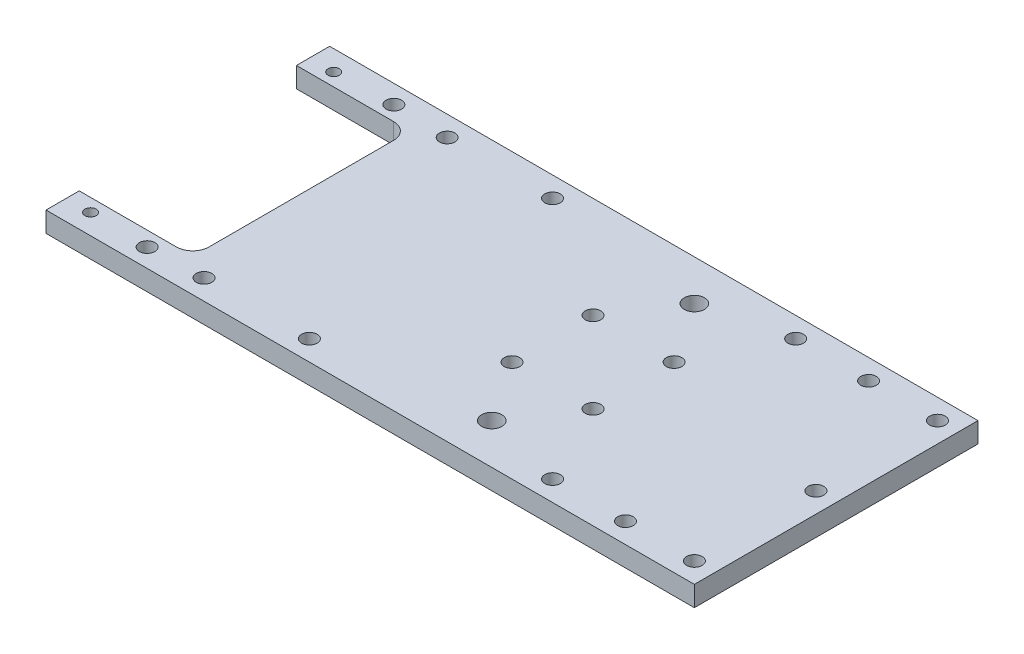
ISO-10303-21;
HEADER;
FILE_DESCRIPTION(('STEP AP214'),'2;1');
FILE_NAME('part.step','',(''),(''),'','','');
FILE_SCHEMA(('AUTOMOTIVE_DESIGN { 1 0 10303 214 1 1 1 1 }'));
ENDSEC;
DATA;
#1=APPLICATION_CONTEXT('core data for automotive mechanical design processes');
#2=APPLICATION_PROTOCOL_DEFINITION('international standard','automotive_design',2000,#1);
#3=PRODUCT_CONTEXT('',#1,'mechanical');
#4=PRODUCT('Part','Part','',(#3));
#5=PRODUCT_RELATED_PRODUCT_CATEGORY('part','',(#4));
#6=PRODUCT_DEFINITION_FORMATION('','',#4);
#7=PRODUCT_DEFINITION_CONTEXT('part definition',#1,'design');
#8=PRODUCT_DEFINITION('design','',#6,#7);
#9=PRODUCT_DEFINITION_SHAPE('','',#8);
#10=(LENGTH_UNIT() NAMED_UNIT(*) SI_UNIT(.MILLI.,.METRE.));
#11=(NAMED_UNIT(*) PLANE_ANGLE_UNIT() SI_UNIT($,.RADIAN.));
#12=(NAMED_UNIT(*) SI_UNIT($,.STERADIAN.) SOLID_ANGLE_UNIT());
#13=UNCERTAINTY_MEASURE_WITH_UNIT(LENGTH_MEASURE(1.E-05),#10,'distance_accuracy_value','');
#14=(GEOMETRIC_REPRESENTATION_CONTEXT(3) GLOBAL_UNCERTAINTY_ASSIGNED_CONTEXT((#13)) GLOBAL_UNIT_ASSIGNED_CONTEXT((#10,
#11,#12)) REPRESENTATION_CONTEXT('',''));
#15=CARTESIAN_POINT('',(0.,0.,0.));
#16=DIRECTION('',(0.,0.,1.));
#17=DIRECTION('',(1.,0.,0.));
#18=AXIS2_PLACEMENT_3D('',#15,#16,#17);
#19=CARTESIAN_POINT('',(-50.8,3.175,22.225));
#20=DIRECTION('',(1.,0.,0.));
#21=DIRECTION('',(0.,0.,-1.));
#22=AXIS2_PLACEMENT_3D('',#19,#20,#21);
#23=PLANE('',#22);
#24=DIRECTION('',(0.,0.,1.));
#25=VECTOR('',#24,1.);
#26=CARTESIAN_POINT('',(-50.8,0.,22.225));
#27=LINE('',#26,#25);
#28=CARTESIAN_POINT('',(-50.8,0.,-22.225));
#29=VERTEX_POINT('',#28);
#30=CARTESIAN_POINT('',(-50.8,0.,-17.018));
#31=VERTEX_POINT('',#30);
#32=EDGE_CURVE('E153',#29,#31,#27,.T.);
#33=ORIENTED_EDGE('',*,*,#32,.T.);
#34=DIRECTION('',(0.,1.,0.));
#35=VECTOR('',#34,1.);
#36=CARTESIAN_POINT('',(-50.8,0.,-17.018));
#37=LINE('',#36,#35);
#38=CARTESIAN_POINT('',(-50.8,3.175,-17.018));
#39=VERTEX_POINT('',#38);
#40=EDGE_CURVE('E144',#31,#39,#37,.T.);
#41=ORIENTED_EDGE('',*,*,#40,.T.);
#42=DIRECTION('',(0.,0.,1.));
#43=VECTOR('',#42,1.);
#44=CARTESIAN_POINT('',(-50.8,3.175,22.225));
#45=LINE('',#44,#43);
#46=CARTESIAN_POINT('',(-50.8,3.175,-22.225));
#47=VERTEX_POINT('',#46);
#48=EDGE_CURVE('E407',#47,#39,#45,.T.);
#49=ORIENTED_EDGE('',*,*,#48,.F.);
#50=DIRECTION('',(0.,-1.,0.));
#51=VECTOR('',#50,1.);
#52=CARTESIAN_POINT('',(-50.8,3.175,-22.225));
#53=LINE('',#52,#51);
#54=EDGE_CURVE('E176',#47,#29,#53,.T.);
#55=ORIENTED_EDGE('',*,*,#54,.T.);
#56=EDGE_LOOP('',(#33,#41,#49,#55));
#57=FACE_BOUND('',#56,.T.);
#58=ADVANCED_FACE('F46',(#57),#23,.F.);
#59=CARTESIAN_POINT('',(50.8,3.175,22.225));
#60=DIRECTION('',(-1.,0.,0.));
#61=DIRECTION('',(0.,0.,1.));
#62=AXIS2_PLACEMENT_3D('',#59,#60,#61);
#63=PLANE('',#62);
#64=DIRECTION('',(0.,0.,-1.));
#65=VECTOR('',#64,1.);
#66=CARTESIAN_POINT('',(50.8,0.,22.225));
#67=LINE('',#66,#65);
#68=CARTESIAN_POINT('',(50.8,0.,22.225));
#69=VERTEX_POINT('',#68);
#70=CARTESIAN_POINT('',(50.8,0.,-22.225));
#71=VERTEX_POINT('',#70);
#72=EDGE_CURVE('E161',#69,#71,#67,.T.);
#73=ORIENTED_EDGE('',*,*,#72,.T.);
#74=DIRECTION('',(0.,-1.,0.));
#75=VECTOR('',#74,1.);
#76=CARTESIAN_POINT('',(50.8,3.175,-22.225));
#77=LINE('',#76,#75);
#78=CARTESIAN_POINT('',(50.8,3.175,-22.225));
#79=VERTEX_POINT('',#78);
#80=EDGE_CURVE('E180',#79,#71,#77,.T.);
#81=ORIENTED_EDGE('',*,*,#80,.F.);
#82=DIRECTION('',(0.,0.,-1.));
#83=VECTOR('',#82,1.);
#84=CARTESIAN_POINT('',(50.8,3.175,22.225));
#85=LINE('',#84,#83);
#86=CARTESIAN_POINT('',(50.8,3.175,22.225));
#87=VERTEX_POINT('',#86);
#88=EDGE_CURVE('E167',#87,#79,#85,.T.);
#89=ORIENTED_EDGE('',*,*,#88,.F.);
#90=DIRECTION('',(0.,-1.,0.));
#91=VECTOR('',#90,1.);
#92=CARTESIAN_POINT('',(50.8,3.175,22.225));
#93=LINE('',#92,#91);
#94=EDGE_CURVE('E168',#87,#69,#93,.T.);
#95=ORIENTED_EDGE('',*,*,#94,.T.);
#96=EDGE_LOOP('',(#73,#81,#89,#95));
#97=FACE_BOUND('',#96,.T.);
#98=ADVANCED_FACE('F416',(#97),#63,.F.);
#99=CARTESIAN_POINT('',(-50.8,3.175,-22.225));
#100=DIRECTION('',(0.,0.,1.));
#101=DIRECTION('',(1.,0.,0.));
#102=AXIS2_PLACEMENT_3D('',#99,#100,#101);
#103=PLANE('',#102);
#104=DIRECTION('',(-1.,0.,0.));
#105=VECTOR('',#104,1.);
#106=CARTESIAN_POINT('',(-50.8,0.,-22.225));
#107=LINE('',#106,#105);
#108=EDGE_CURVE('E154',#71,#29,#107,.T.);
#109=ORIENTED_EDGE('',*,*,#108,.T.);
#110=ORIENTED_EDGE('',*,*,#54,.F.);
#111=DIRECTION('',(-1.,0.,0.));
#112=VECTOR('',#111,1.);
#113=CARTESIAN_POINT('',(-50.8,3.175,-22.225));
#114=LINE('',#113,#112);
#115=EDGE_CURVE('E404',#79,#47,#114,.T.);
#116=ORIENTED_EDGE('',*,*,#115,.F.);
#117=ORIENTED_EDGE('',*,*,#80,.T.);
#118=EDGE_LOOP('',(#109,#110,#116,#117));
#119=FACE_BOUND('',#118,.T.);
#120=ADVANCED_FACE('F421',(#119),#103,.F.);
#121=CARTESIAN_POINT('',(-50.8,3.175,17.018));
#122=VERTEX_POINT('',#121);
#123=CARTESIAN_POINT('',(-50.8,3.175,22.225));
#124=VERTEX_POINT('',#123);
#125=EDGE_CURVE('E142',#122,#124,#45,.T.);
#126=ORIENTED_EDGE('',*,*,#125,.F.);
#127=DIRECTION('',(0.,1.,0.));
#128=VECTOR('',#127,1.);
#129=CARTESIAN_POINT('',(-50.8,0.,17.018));
#130=LINE('',#129,#128);
#131=CARTESIAN_POINT('',(-50.8,0.,17.018));
#132=VERTEX_POINT('',#131);
#133=EDGE_CURVE('E126',#132,#122,#130,.T.);
#134=ORIENTED_EDGE('',*,*,#133,.F.);
#135=CARTESIAN_POINT('',(-50.8,0.,22.225));
#136=VERTEX_POINT('',#135);
#137=EDGE_CURVE('E140',#132,#136,#27,.T.);
#138=ORIENTED_EDGE('',*,*,#137,.T.);
#139=DIRECTION('',(0.,-1.,0.));
#140=VECTOR('',#139,1.);
#141=CARTESIAN_POINT('',(-50.8,3.175,22.225));
#142=LINE('',#141,#140);
#143=EDGE_CURVE('E172',#124,#136,#142,.T.);
#144=ORIENTED_EDGE('',*,*,#143,.F.);
#145=EDGE_LOOP('',(#126,#134,#138,#144));
#146=FACE_BOUND('',#145,.T.);
#147=ADVANCED_FACE('F138',(#146),#23,.F.);
#148=CARTESIAN_POINT('',(-50.8,3.175,22.225));
#149=DIRECTION('',(0.,0.,-1.));
#150=DIRECTION('',(-1.,0.,0.));
#151=AXIS2_PLACEMENT_3D('',#148,#149,#150);
#152=PLANE('',#151);
#153=DIRECTION('',(1.,0.,0.));
#154=VECTOR('',#153,1.);
#155=CARTESIAN_POINT('',(-50.8,0.,22.225));
#156=LINE('',#155,#154);
#157=EDGE_CURVE('E151',#136,#69,#156,.T.);
#158=ORIENTED_EDGE('',*,*,#157,.T.);
#159=ORIENTED_EDGE('',*,*,#94,.F.);
#160=DIRECTION('',(1.,0.,0.));
#161=VECTOR('',#160,1.);
#162=CARTESIAN_POINT('',(-50.8,3.175,22.225));
#163=LINE('',#162,#161);
#164=EDGE_CURVE('E173',#124,#87,#163,.T.);
#165=ORIENTED_EDGE('',*,*,#164,.F.);
#166=ORIENTED_EDGE('',*,*,#143,.T.);
#167=EDGE_LOOP('',(#158,#159,#165,#166));
#168=FACE_BOUND('',#167,.T.);
#169=ADVANCED_FACE('F425',(#168),#152,.F.);
#170=CARTESIAN_POINT('',(0.,3.175,0.));
#171=DIRECTION('',(0.,-1.,0.));
#172=DIRECTION('',(0.,0.,-1.));
#173=AXIS2_PLACEMENT_3D('',#170,#171,#172);
#174=PLANE('',#173);
#175=CARTESIAN_POINT('',(-37.846,3.175,19.3294));
#176=DIRECTION('',(0.,-1.,0.));
#177=DIRECTION('',(0.,0.,-1.));
#178=AXIS2_PLACEMENT_3D('',#175,#176,#177);
#179=CIRCLE('',#178,1.2192);
#180=CARTESIAN_POINT('',(-37.846,3.175,18.1102));
#181=VERTEX_POINT('',#180);
#182=EDGE_CURVE('E244',#181,#181,#179,.T.);
#183=ORIENTED_EDGE('',*,*,#182,.T.);
#184=EDGE_LOOP('',(#183));
#185=FACE_BOUND('',#184,.T.);
#186=CARTESIAN_POINT('',(12.7,3.175,15.875));
#187=DIRECTION('',(0.,-1.,0.));
#188=DIRECTION('',(0.,0.,-1.));
#189=AXIS2_PLACEMENT_3D('',#186,#187,#188);
#190=CIRCLE('',#189,1.5875);
#191=CARTESIAN_POINT('',(12.7,3.175,14.2875));
#192=VERTEX_POINT('',#191);
#193=EDGE_CURVE('E237',#192,#192,#190,.T.);
#194=ORIENTED_EDGE('',*,*,#193,.T.);
#195=EDGE_LOOP('',(#194));
#196=FACE_BOUND('',#195,.T.);
#197=CARTESIAN_POINT('',(-37.846,3.175,-19.3294));
#198=DIRECTION('',(0.,1.,0.));
#199=DIRECTION('',(0.,0.,1.));
#200=AXIS2_PLACEMENT_3D('',#197,#198,#199);
#201=CIRCLE('',#200,1.2192);
#202=CARTESIAN_POINT('',(-37.846,3.175,-18.1102));
#203=VERTEX_POINT('',#202);
#204=EDGE_CURVE('E259',#203,#203,#201,.T.);
#205=ORIENTED_EDGE('',*,*,#204,.F.);
#206=EDGE_LOOP('',(#205));
#207=FACE_BOUND('',#206,.T.);
#208=CARTESIAN_POINT('',(12.7,3.175,-15.875));
#209=DIRECTION('',(0.,1.,0.));
#210=DIRECTION('',(0.,0.,1.));
#211=AXIS2_PLACEMENT_3D('',#208,#209,#210);
#212=CIRCLE('',#211,1.5875);
#213=CARTESIAN_POINT('',(12.7,3.175,-14.2875));
#214=VERTEX_POINT('',#213);
#215=EDGE_CURVE('E263',#214,#214,#212,.T.);
#216=ORIENTED_EDGE('',*,*,#215,.F.);
#217=EDGE_LOOP('',(#216));
#218=FACE_BOUND('',#217,.T.);
#219=CARTESIAN_POINT('',(36.83,3.175,19.05));
#220=DIRECTION('',(0.,1.,0.));
#221=DIRECTION('',(0.,0.,1.));
#222=AXIS2_PLACEMENT_3D('',#219,#220,#221);
#223=CIRCLE('',#222,1.2192);
#224=CARTESIAN_POINT('',(36.83,3.175,20.2692));
#225=VERTEX_POINT('',#224);
#226=EDGE_CURVE('E357',#225,#225,#223,.T.);
#227=ORIENTED_EDGE('',*,*,#226,.F.);
#228=EDGE_LOOP('',(#227));
#229=FACE_BOUND('',#228,.T.);
#230=CARTESIAN_POINT('',(47.625,3.175,19.05));
#231=DIRECTION('',(0.,1.,0.));
#232=DIRECTION('',(0.,0.,1.));
#233=AXIS2_PLACEMENT_3D('',#230,#231,#232);
#234=CIRCLE('',#233,1.2192);
#235=CARTESIAN_POINT('',(47.625,3.175,20.2692));
#236=VERTEX_POINT('',#235);
#237=EDGE_CURVE('E349',#236,#236,#234,.T.);
#238=ORIENTED_EDGE('',*,*,#237,.F.);
#239=EDGE_LOOP('',(#238));
#240=FACE_BOUND('',#239,.T.);
#241=CARTESIAN_POINT('',(47.625,3.175,0.));
#242=DIRECTION('',(0.,1.,0.));
#243=DIRECTION('',(0.,0.,1.));
#244=AXIS2_PLACEMENT_3D('',#241,#242,#243);
#245=CIRCLE('',#244,1.2192);
#246=CARTESIAN_POINT('',(47.625,3.175,1.2192));
#247=VERTEX_POINT('',#246);
#248=EDGE_CURVE('E341',#247,#247,#245,.T.);
#249=ORIENTED_EDGE('',*,*,#248,.F.);
#250=EDGE_LOOP('',(#249));
#251=FACE_BOUND('',#250,.T.);
#252=CARTESIAN_POINT('',(47.625,3.175,-19.05));
#253=DIRECTION('',(0.,1.,0.));
#254=DIRECTION('',(0.,0.,1.));
#255=AXIS2_PLACEMENT_3D('',#252,#253,#254);
#256=CIRCLE('',#255,1.2192);
#257=CARTESIAN_POINT('',(47.625,3.175,-17.8308));
#258=VERTEX_POINT('',#257);
#259=EDGE_CURVE('E332',#258,#258,#256,.T.);
#260=ORIENTED_EDGE('',*,*,#259,.F.);
#261=EDGE_LOOP('',(#260));
#262=FACE_BOUND('',#261,.T.);
#263=CARTESIAN_POINT('',(36.83,3.175,-19.05));
#264=DIRECTION('',(0.,1.,0.));
#265=DIRECTION('',(0.,0.,1.));
#266=AXIS2_PLACEMENT_3D('',#263,#264,#265);
#267=CIRCLE('',#266,1.2192);
#268=CARTESIAN_POINT('',(36.83,3.175,-17.8308));
#269=VERTEX_POINT('',#268);
#270=EDGE_CURVE('E387',#269,#269,#267,.T.);
#271=ORIENTED_EDGE('',*,*,#270,.F.);
#272=EDGE_LOOP('',(#271));
#273=FACE_BOUND('',#272,.T.);
#274=CARTESIAN_POINT('',(25.4,3.175,-19.05));
#275=DIRECTION('',(0.,1.,0.));
#276=DIRECTION('',(0.,0.,1.));
#277=AXIS2_PLACEMENT_3D('',#274,#275,#276);
#278=CIRCLE('',#277,1.2192);
#279=CARTESIAN_POINT('',(25.4,3.175,-17.8308));
#280=VERTEX_POINT('',#279);
#281=EDGE_CURVE('E379',#280,#280,#278,.T.);
#282=ORIENTED_EDGE('',*,*,#281,.F.);
#283=EDGE_LOOP('',(#282));
#284=FACE_BOUND('',#283,.T.);
#285=CARTESIAN_POINT('',(-12.7,3.175,-19.05));
#286=DIRECTION('',(0.,1.,0.));
#287=DIRECTION('',(0.,0.,1.));
#288=AXIS2_PLACEMENT_3D('',#285,#286,#287);
#289=CIRCLE('',#288,1.2192);
#290=CARTESIAN_POINT('',(-12.7,3.175,-17.8308));
#291=VERTEX_POINT('',#290);
#292=EDGE_CURVE('E372',#291,#291,#289,.T.);
#293=ORIENTED_EDGE('',*,*,#292,.F.);
#294=EDGE_LOOP('',(#293));
#295=FACE_BOUND('',#294,.T.);
#296=CARTESIAN_POINT('',(-29.21,3.175,-19.05));
#297=DIRECTION('',(0.,1.,0.));
#298=DIRECTION('',(0.,0.,1.));
#299=AXIS2_PLACEMENT_3D('',#296,#297,#298);
#300=CIRCLE('',#299,1.2192);
#301=CARTESIAN_POINT('',(-29.21,3.175,-17.8308));
#302=VERTEX_POINT('',#301);
#303=EDGE_CURVE('E363',#302,#302,#300,.T.);
#304=ORIENTED_EDGE('',*,*,#303,.F.);
#305=EDGE_LOOP('',(#304));
#306=FACE_BOUND('',#305,.T.);
#307=CARTESIAN_POINT('',(25.4,3.175,19.05));
#308=DIRECTION('',(0.,1.,0.));
#309=DIRECTION('',(0.,0.,1.));
#310=AXIS2_PLACEMENT_3D('',#307,#308,#309);
#311=CIRCLE('',#310,1.2192);
#312=CARTESIAN_POINT('',(25.4,3.175,20.2692));
#313=VERTEX_POINT('',#312);
#314=EDGE_CURVE('E269',#313,#313,#311,.T.);
#315=ORIENTED_EDGE('',*,*,#314,.F.);
#316=EDGE_LOOP('',(#315));
#317=FACE_BOUND('',#316,.T.);
#318=CARTESIAN_POINT('',(-12.7,3.175,19.05));
#319=DIRECTION('',(0.,1.,0.));
#320=DIRECTION('',(0.,0.,1.));
#321=AXIS2_PLACEMENT_3D('',#318,#319,#320);
#322=CIRCLE('',#321,1.2192);
#323=CARTESIAN_POINT('',(-12.7,3.175,20.2692));
#324=VERTEX_POINT('',#323);
#325=EDGE_CURVE('E277',#324,#324,#322,.T.);
#326=ORIENTED_EDGE('',*,*,#325,.F.);
#327=EDGE_LOOP('',(#326));
#328=FACE_BOUND('',#327,.T.);
#329=CARTESIAN_POINT('',(-29.21,3.175,19.05));
#330=DIRECTION('',(0.,1.,0.));
#331=DIRECTION('',(0.,0.,1.));
#332=AXIS2_PLACEMENT_3D('',#329,#330,#331);
#333=CIRCLE('',#332,1.2192);
#334=CARTESIAN_POINT('',(-29.21,3.175,20.2692));
#335=VERTEX_POINT('',#334);
#336=EDGE_CURVE('E285',#335,#335,#333,.T.);
#337=ORIENTED_EDGE('',*,*,#336,.F.);
#338=EDGE_LOOP('',(#337));
#339=FACE_BOUND('',#338,.T.);
#340=CARTESIAN_POINT('',(-46.99,3.175,19.05));
#341=DIRECTION('',(0.,1.,0.));
#342=DIRECTION('',(0.,0.,1.));
#343=AXIS2_PLACEMENT_3D('',#340,#341,#342);
#344=CIRCLE('',#343,0.889000000000003);
#345=CARTESIAN_POINT('',(-46.99,3.175,19.939));
#346=VERTEX_POINT('',#345);
#347=EDGE_CURVE('E293',#346,#346,#344,.T.);
#348=ORIENTED_EDGE('',*,*,#347,.F.);
#349=EDGE_LOOP('',(#348));
#350=FACE_BOUND('',#349,.T.);
#351=CARTESIAN_POINT('',(19.05,3.175,6.35));
#352=DIRECTION('',(0.,1.,0.));
#353=DIRECTION('',(0.,0.,1.));
#354=AXIS2_PLACEMENT_3D('',#351,#352,#353);
#355=CIRCLE('',#354,1.2192);
#356=CARTESIAN_POINT('',(19.05,3.175,7.5692));
#357=VERTEX_POINT('',#356);
#358=EDGE_CURVE('E301',#357,#357,#355,.T.);
#359=ORIENTED_EDGE('',*,*,#358,.F.);
#360=EDGE_LOOP('',(#359));
#361=FACE_BOUND('',#360,.T.);
#362=CARTESIAN_POINT('',(19.05,3.175,-6.35));
#363=DIRECTION('',(0.,1.,0.));
#364=DIRECTION('',(0.,0.,1.));
#365=AXIS2_PLACEMENT_3D('',#362,#363,#364);
#366=CIRCLE('',#365,1.2192);
#367=CARTESIAN_POINT('',(19.05,3.175,-5.1308));
#368=VERTEX_POINT('',#367);
#369=EDGE_CURVE('E309',#368,#368,#366,.T.);
#370=ORIENTED_EDGE('',*,*,#369,.F.);
#371=EDGE_LOOP('',(#370));
#372=FACE_BOUND('',#371,.T.);
#373=CARTESIAN_POINT('',(6.35,3.175,-6.35));
#374=DIRECTION('',(0.,1.,0.));
#375=DIRECTION('',(0.,0.,1.));
#376=AXIS2_PLACEMENT_3D('',#373,#374,#375);
#377=CIRCLE('',#376,1.2192);
#378=CARTESIAN_POINT('',(6.35,3.175,-5.1308));
#379=VERTEX_POINT('',#378);
#380=EDGE_CURVE('E317',#379,#379,#377,.T.);
#381=ORIENTED_EDGE('',*,*,#380,.F.);
#382=EDGE_LOOP('',(#381));
#383=FACE_BOUND('',#382,.T.);
#384=CARTESIAN_POINT('',(6.35,3.175,6.35));
#385=DIRECTION('',(0.,1.,0.));
#386=DIRECTION('',(0.,0.,1.));
#387=AXIS2_PLACEMENT_3D('',#384,#385,#386);
#388=CIRCLE('',#387,1.2192);
#389=CARTESIAN_POINT('',(6.35,3.175,7.5692));
#390=VERTEX_POINT('',#389);
#391=EDGE_CURVE('E325',#390,#390,#388,.T.);
#392=ORIENTED_EDGE('',*,*,#391,.F.);
#393=EDGE_LOOP('',(#392));
#394=FACE_BOUND('',#393,.T.);
#395=CARTESIAN_POINT('',(-46.99,3.175,-19.05));
#396=DIRECTION('',(0.,1.,0.));
#397=DIRECTION('',(0.,0.,1.));
#398=AXIS2_PLACEMENT_3D('',#395,#396,#397);
#399=CIRCLE('',#398,0.889000000000003);
#400=CARTESIAN_POINT('',(-46.99,3.175,-18.161));
#401=VERTEX_POINT('',#400);
#402=EDGE_CURVE('E367',#401,#401,#399,.T.);
#403=ORIENTED_EDGE('',*,*,#402,.F.);
#404=EDGE_LOOP('',(#403));
#405=FACE_BOUND('',#404,.T.);
#406=ORIENTED_EDGE('',*,*,#48,.T.);
#407=DIRECTION('',(-1.,0.,0.));
#408=VECTOR('',#407,1.);
#409=CARTESIAN_POINT('',(-33.02,3.175,-17.018));
#410=LINE('',#409,#408);
#411=CARTESIAN_POINT('',(-35.56,3.175,-17.018));
#412=VERTEX_POINT('',#411);
#413=EDGE_CURVE('E134',#412,#39,#410,.T.);
#414=ORIENTED_EDGE('',*,*,#413,.F.);
#415=CARTESIAN_POINT('',(-35.56,3.175,-14.478));
#416=DIRECTION('',(0.,-1.,0.));
#417=DIRECTION('',(0.,0.,-1.));
#418=AXIS2_PLACEMENT_3D('',#415,#416,#417);
#419=CIRCLE('',#418,2.54);
#420=CARTESIAN_POINT('',(-33.02,3.175,-14.478));
#421=VERTEX_POINT('',#420);
#422=EDGE_CURVE('E55',#412,#421,#419,.T.);
#423=ORIENTED_EDGE('',*,*,#422,.T.);
#424=DIRECTION('',(0.,0.,-1.));
#425=VECTOR('',#424,1.);
#426=CARTESIAN_POINT('',(-33.02,3.175,17.018));
#427=LINE('',#426,#425);
#428=CARTESIAN_POINT('',(-33.02,3.175,14.478));
#429=VERTEX_POINT('',#428);
#430=EDGE_CURVE('E211',#429,#421,#427,.T.);
#431=ORIENTED_EDGE('',*,*,#430,.F.);
#432=CARTESIAN_POINT('',(-35.56,3.175,14.478));
#433=DIRECTION('',(0.,-1.,0.));
#434=DIRECTION('',(0.,0.,-1.));
#435=AXIS2_PLACEMENT_3D('',#432,#433,#434);
#436=CIRCLE('',#435,2.54);
#437=CARTESIAN_POINT('',(-35.56,3.175,17.018));
#438=VERTEX_POINT('',#437);
#439=EDGE_CURVE('E196',#429,#438,#436,.T.);
#440=ORIENTED_EDGE('',*,*,#439,.T.);
#441=DIRECTION('',(1.,0.,0.));
#442=VECTOR('',#441,1.);
#443=CARTESIAN_POINT('',(-33.02,3.175,17.018));
#444=LINE('',#443,#442);
#445=EDGE_CURVE('E217',#122,#438,#444,.T.);
#446=ORIENTED_EDGE('',*,*,#445,.F.);
#447=ORIENTED_EDGE('',*,*,#125,.T.);
#448=ORIENTED_EDGE('',*,*,#164,.T.);
#449=ORIENTED_EDGE('',*,*,#88,.T.);
#450=ORIENTED_EDGE('',*,*,#115,.T.);
#451=EDGE_LOOP('',(#406,#414,#423,#431,#440,#446,#447,#448,#449,#450));
#452=FACE_BOUND('',#451,.T.);
#453=ADVANCED_FACE('F210',(#185,#196,#207,#218,#229,#240,#251,#262,#273,#284,#295,#306,#317,
#328,#339,#350,#361,#372,#383,#394,#405,#452),#174,.F.);
#454=CARTESIAN_POINT('',(0.,0.,0.));
#455=DIRECTION('',(0.,-1.,0.));
#456=DIRECTION('',(0.,0.,-1.));
#457=AXIS2_PLACEMENT_3D('',#454,#455,#456);
#458=PLANE('',#457);
#459=DIRECTION('',(0.,0.,-1.));
#460=VECTOR('',#459,1.);
#461=CARTESIAN_POINT('',(-33.02,0.,17.018));
#462=LINE('',#461,#460);
#463=CARTESIAN_POINT('',(-33.02,0.,14.478));
#464=VERTEX_POINT('',#463);
#465=CARTESIAN_POINT('',(-33.02,0.,-14.478));
#466=VERTEX_POINT('',#465);
#467=EDGE_CURVE('E133',#464,#466,#462,.T.);
#468=ORIENTED_EDGE('',*,*,#467,.T.);
#469=CARTESIAN_POINT('',(-35.56,0.,-14.478));
#470=DIRECTION('',(0.,-1.,0.));
#471=DIRECTION('',(0.,0.,-1.));
#472=AXIS2_PLACEMENT_3D('',#469,#470,#471);
#473=CIRCLE('',#472,2.54);
#474=CARTESIAN_POINT('',(-35.56,0.,-17.018));
#475=VERTEX_POINT('',#474);
#476=EDGE_CURVE('E11',#466,#475,#473,.F.);
#477=ORIENTED_EDGE('',*,*,#476,.T.);
#478=DIRECTION('',(-1.,0.,0.));
#479=VECTOR('',#478,1.);
#480=CARTESIAN_POINT('',(-33.02,0.,-17.018));
#481=LINE('',#480,#479);
#482=EDGE_CURVE('E145',#475,#31,#481,.T.);
#483=ORIENTED_EDGE('',*,*,#482,.T.);
#484=ORIENTED_EDGE('',*,*,#32,.F.);
#485=ORIENTED_EDGE('',*,*,#108,.F.);
#486=ORIENTED_EDGE('',*,*,#72,.F.);
#487=ORIENTED_EDGE('',*,*,#157,.F.);
#488=ORIENTED_EDGE('',*,*,#137,.F.);
#489=DIRECTION('',(1.,0.,0.));
#490=VECTOR('',#489,1.);
#491=CARTESIAN_POINT('',(-33.02,0.,17.018));
#492=LINE('',#491,#490);
#493=CARTESIAN_POINT('',(-35.56,0.,17.018));
#494=VERTEX_POINT('',#493);
#495=EDGE_CURVE('E122',#132,#494,#492,.T.);
#496=ORIENTED_EDGE('',*,*,#495,.T.);
#497=CARTESIAN_POINT('',(-35.56,0.,14.478));
#498=DIRECTION('',(0.,-1.,0.));
#499=DIRECTION('',(0.,0.,-1.));
#500=AXIS2_PLACEMENT_3D('',#497,#498,#499);
#501=CIRCLE('',#500,2.54);
#502=EDGE_CURVE('E199',#494,#464,#501,.F.);
#503=ORIENTED_EDGE('',*,*,#502,.T.);
#504=EDGE_LOOP('',(#468,#477,#483,#484,#485,#486,#487,#488,#496,#503));
#505=FACE_BOUND('',#504,.T.);
#506=CARTESIAN_POINT('',(-37.846,0.,19.3294));
#507=DIRECTION('',(0.,-1.,0.));
#508=DIRECTION('',(0.,0.,-1.));
#509=AXIS2_PLACEMENT_3D('',#506,#507,#508);
#510=CIRCLE('',#509,1.2192);
#511=CARTESIAN_POINT('',(-37.846,0.,18.1102));
#512=VERTEX_POINT('',#511);
#513=EDGE_CURVE('E239',#512,#512,#510,.T.);
#514=ORIENTED_EDGE('',*,*,#513,.F.);
#515=EDGE_LOOP('',(#514));
#516=FACE_BOUND('',#515,.T.);
#517=CARTESIAN_POINT('',(12.7,0.,15.875));
#518=DIRECTION('',(0.,-1.,0.));
#519=DIRECTION('',(0.,0.,-1.));
#520=AXIS2_PLACEMENT_3D('',#517,#518,#519);
#521=CIRCLE('',#520,1.5875);
#522=CARTESIAN_POINT('',(12.7,0.,14.2875));
#523=VERTEX_POINT('',#522);
#524=EDGE_CURVE('E248',#523,#523,#521,.T.);
#525=ORIENTED_EDGE('',*,*,#524,.F.);
#526=EDGE_LOOP('',(#525));
#527=FACE_BOUND('',#526,.T.);
#528=CARTESIAN_POINT('',(-37.846,0.,-19.3294));
#529=DIRECTION('',(0.,1.,0.));
#530=DIRECTION('',(0.,0.,1.));
#531=AXIS2_PLACEMENT_3D('',#528,#529,#530);
#532=CIRCLE('',#531,1.2192);
#533=CARTESIAN_POINT('',(-37.846,0.,-18.1102));
#534=VERTEX_POINT('',#533);
#535=EDGE_CURVE('E254',#534,#534,#532,.T.);
#536=ORIENTED_EDGE('',*,*,#535,.T.);
#537=EDGE_LOOP('',(#536));
#538=FACE_BOUND('',#537,.T.);
#539=CARTESIAN_POINT('',(12.7,0.,-15.875));
#540=DIRECTION('',(0.,1.,0.));
#541=DIRECTION('',(0.,0.,1.));
#542=AXIS2_PLACEMENT_3D('',#539,#540,#541);
#543=CIRCLE('',#542,1.5875);
#544=CARTESIAN_POINT('',(12.7,0.,-14.2875));
#545=VERTEX_POINT('',#544);
#546=EDGE_CURVE('E243',#545,#545,#543,.T.);
#547=ORIENTED_EDGE('',*,*,#546,.T.);
#548=EDGE_LOOP('',(#547));
#549=FACE_BOUND('',#548,.T.);
#550=CARTESIAN_POINT('',(36.83,0.,19.05));
#551=DIRECTION('',(0.,1.,0.));
#552=DIRECTION('',(0.,0.,1.));
#553=AXIS2_PLACEMENT_3D('',#550,#551,#552);
#554=CIRCLE('',#553,1.2192);
#555=CARTESIAN_POINT('',(36.83,0.,20.2692));
#556=VERTEX_POINT('',#555);
#557=EDGE_CURVE('E272',#556,#556,#554,.T.);
#558=ORIENTED_EDGE('',*,*,#557,.T.);
#559=EDGE_LOOP('',(#558));
#560=FACE_BOUND('',#559,.T.);
#561=CARTESIAN_POINT('',(47.625,0.,19.05));
#562=DIRECTION('',(0.,1.,0.));
#563=DIRECTION('',(0.,0.,1.));
#564=AXIS2_PLACEMENT_3D('',#561,#562,#563);
#565=CIRCLE('',#564,1.2192);
#566=CARTESIAN_POINT('',(47.625,0.,20.2692));
#567=VERTEX_POINT('',#566);
#568=EDGE_CURVE('E353',#567,#567,#565,.T.);
#569=ORIENTED_EDGE('',*,*,#568,.T.);
#570=EDGE_LOOP('',(#569));
#571=FACE_BOUND('',#570,.T.);
#572=CARTESIAN_POINT('',(47.625,0.,0.));
#573=DIRECTION('',(0.,1.,0.));
#574=DIRECTION('',(0.,0.,1.));
#575=AXIS2_PLACEMENT_3D('',#572,#573,#574);
#576=CIRCLE('',#575,1.2192);
#577=CARTESIAN_POINT('',(47.625,0.,1.2192));
#578=VERTEX_POINT('',#577);
#579=EDGE_CURVE('E345',#578,#578,#576,.T.);
#580=ORIENTED_EDGE('',*,*,#579,.T.);
#581=EDGE_LOOP('',(#580));
#582=FACE_BOUND('',#581,.T.);
#583=CARTESIAN_POINT('',(47.625,0.,-19.05));
#584=DIRECTION('',(0.,1.,0.));
#585=DIRECTION('',(0.,0.,1.));
#586=AXIS2_PLACEMENT_3D('',#583,#584,#585);
#587=CIRCLE('',#586,1.2192);
#588=CARTESIAN_POINT('',(47.625,0.,-17.8308));
#589=VERTEX_POINT('',#588);
#590=EDGE_CURVE('E337',#589,#589,#587,.T.);
#591=ORIENTED_EDGE('',*,*,#590,.T.);
#592=EDGE_LOOP('',(#591));
#593=FACE_BOUND('',#592,.T.);
#594=CARTESIAN_POINT('',(36.83,0.,-19.05));
#595=DIRECTION('',(0.,1.,0.));
#596=DIRECTION('',(0.,0.,1.));
#597=AXIS2_PLACEMENT_3D('',#594,#595,#596);
#598=CIRCLE('',#597,1.2192);
#599=CARTESIAN_POINT('',(36.83,0.,-17.8308));
#600=VERTEX_POINT('',#599);
#601=EDGE_CURVE('E336',#600,#600,#598,.T.);
#602=ORIENTED_EDGE('',*,*,#601,.T.);
#603=EDGE_LOOP('',(#602));
#604=FACE_BOUND('',#603,.T.);
#605=CARTESIAN_POINT('',(25.4,0.,-19.05));
#606=DIRECTION('',(0.,1.,0.));
#607=DIRECTION('',(0.,0.,1.));
#608=AXIS2_PLACEMENT_3D('',#605,#606,#607);
#609=CIRCLE('',#608,1.2192);
#610=CARTESIAN_POINT('',(25.4,0.,-17.8308));
#611=VERTEX_POINT('',#610);
#612=EDGE_CURVE('E383',#611,#611,#609,.T.);
#613=ORIENTED_EDGE('',*,*,#612,.T.);
#614=EDGE_LOOP('',(#613));
#615=FACE_BOUND('',#614,.T.);
#616=CARTESIAN_POINT('',(-12.7,0.,-19.05));
#617=DIRECTION('',(0.,1.,0.));
#618=DIRECTION('',(0.,0.,1.));
#619=AXIS2_PLACEMENT_3D('',#616,#617,#618);
#620=CIRCLE('',#619,1.2192);
#621=CARTESIAN_POINT('',(-12.7,0.,-17.8308));
#622=VERTEX_POINT('',#621);
#623=EDGE_CURVE('E376',#622,#622,#620,.T.);
#624=ORIENTED_EDGE('',*,*,#623,.T.);
#625=EDGE_LOOP('',(#624));
#626=FACE_BOUND('',#625,.T.);
#627=CARTESIAN_POINT('',(-29.21,0.,-19.05));
#628=DIRECTION('',(0.,1.,0.));
#629=DIRECTION('',(0.,0.,1.));
#630=AXIS2_PLACEMENT_3D('',#627,#628,#629);
#631=CIRCLE('',#630,1.2192);
#632=CARTESIAN_POINT('',(-29.21,0.,-17.8308));
#633=VERTEX_POINT('',#632);
#634=EDGE_CURVE('E368',#633,#633,#631,.T.);
#635=ORIENTED_EDGE('',*,*,#634,.T.);
#636=EDGE_LOOP('',(#635));
#637=FACE_BOUND('',#636,.T.);
#638=CARTESIAN_POINT('',(25.4,0.,19.05));
#639=DIRECTION('',(0.,1.,0.));
#640=DIRECTION('',(0.,0.,1.));
#641=AXIS2_PLACEMENT_3D('',#638,#639,#640);
#642=CIRCLE('',#641,1.2192);
#643=CARTESIAN_POINT('',(25.4,0.,20.2692));
#644=VERTEX_POINT('',#643);
#645=EDGE_CURVE('E273',#644,#644,#642,.T.);
#646=ORIENTED_EDGE('',*,*,#645,.T.);
#647=EDGE_LOOP('',(#646));
#648=FACE_BOUND('',#647,.T.);
#649=CARTESIAN_POINT('',(-12.7,0.,19.05));
#650=DIRECTION('',(0.,1.,0.));
#651=DIRECTION('',(0.,0.,1.));
#652=AXIS2_PLACEMENT_3D('',#649,#650,#651);
#653=CIRCLE('',#652,1.2192);
#654=CARTESIAN_POINT('',(-12.7,0.,20.2692));
#655=VERTEX_POINT('',#654);
#656=EDGE_CURVE('E281',#655,#655,#653,.T.);
#657=ORIENTED_EDGE('',*,*,#656,.T.);
#658=EDGE_LOOP('',(#657));
#659=FACE_BOUND('',#658,.T.);
#660=CARTESIAN_POINT('',(-29.21,0.,19.05));
#661=DIRECTION('',(0.,1.,0.));
#662=DIRECTION('',(0.,0.,1.));
#663=AXIS2_PLACEMENT_3D('',#660,#661,#662);
#664=CIRCLE('',#663,1.2192);
#665=CARTESIAN_POINT('',(-29.21,0.,20.2692));
#666=VERTEX_POINT('',#665);
#667=EDGE_CURVE('E289',#666,#666,#664,.T.);
#668=ORIENTED_EDGE('',*,*,#667,.T.);
#669=EDGE_LOOP('',(#668));
#670=FACE_BOUND('',#669,.T.);
#671=CARTESIAN_POINT('',(-46.99,0.,19.05));
#672=DIRECTION('',(0.,1.,0.));
#673=DIRECTION('',(0.,0.,1.));
#674=AXIS2_PLACEMENT_3D('',#671,#672,#673);
#675=CIRCLE('',#674,0.889000000000003);
#676=CARTESIAN_POINT('',(-46.99,0.,19.939));
#677=VERTEX_POINT('',#676);
#678=EDGE_CURVE('E297',#677,#677,#675,.T.);
#679=ORIENTED_EDGE('',*,*,#678,.T.);
#680=EDGE_LOOP('',(#679));
#681=FACE_BOUND('',#680,.T.);
#682=CARTESIAN_POINT('',(19.05,0.,6.35));
#683=DIRECTION('',(0.,1.,0.));
#684=DIRECTION('',(0.,0.,1.));
#685=AXIS2_PLACEMENT_3D('',#682,#683,#684);
#686=CIRCLE('',#685,1.2192);
#687=CARTESIAN_POINT('',(19.05,0.,7.5692));
#688=VERTEX_POINT('',#687);
#689=EDGE_CURVE('E305',#688,#688,#686,.T.);
#690=ORIENTED_EDGE('',*,*,#689,.T.);
#691=EDGE_LOOP('',(#690));
#692=FACE_BOUND('',#691,.T.);
#693=CARTESIAN_POINT('',(19.05,0.,-6.35));
#694=DIRECTION('',(0.,1.,0.));
#695=DIRECTION('',(0.,0.,1.));
#696=AXIS2_PLACEMENT_3D('',#693,#694,#695);
#697=CIRCLE('',#696,1.2192);
#698=CARTESIAN_POINT('',(19.05,0.,-5.1308));
#699=VERTEX_POINT('',#698);
#700=EDGE_CURVE('E313',#699,#699,#697,.T.);
#701=ORIENTED_EDGE('',*,*,#700,.T.);
#702=EDGE_LOOP('',(#701));
#703=FACE_BOUND('',#702,.T.);
#704=CARTESIAN_POINT('',(6.35,0.,-6.35));
#705=DIRECTION('',(0.,1.,0.));
#706=DIRECTION('',(0.,0.,1.));
#707=AXIS2_PLACEMENT_3D('',#704,#705,#706);
#708=CIRCLE('',#707,1.2192);
#709=CARTESIAN_POINT('',(6.35,0.,-5.1308));
#710=VERTEX_POINT('',#709);
#711=EDGE_CURVE('E321',#710,#710,#708,.T.);
#712=ORIENTED_EDGE('',*,*,#711,.T.);
#713=EDGE_LOOP('',(#712));
#714=FACE_BOUND('',#713,.T.);
#715=CARTESIAN_POINT('',(6.35,0.,6.35));
#716=DIRECTION('',(0.,1.,0.));
#717=DIRECTION('',(0.,0.,1.));
#718=AXIS2_PLACEMENT_3D('',#715,#716,#717);
#719=CIRCLE('',#718,1.2192);
#720=CARTESIAN_POINT('',(6.35,0.,7.5692));
#721=VERTEX_POINT('',#720);
#722=EDGE_CURVE('E258',#721,#721,#719,.T.);
#723=ORIENTED_EDGE('',*,*,#722,.T.);
#724=EDGE_LOOP('',(#723));
#725=FACE_BOUND('',#724,.T.);
#726=CARTESIAN_POINT('',(-46.99,0.,-19.05));
#727=DIRECTION('',(0.,1.,0.));
#728=DIRECTION('',(0.,0.,1.));
#729=AXIS2_PLACEMENT_3D('',#726,#727,#728);
#730=CIRCLE('',#729,0.889000000000003);
#731=CARTESIAN_POINT('',(-46.99,0.,-18.161));
#732=VERTEX_POINT('',#731);
#733=EDGE_CURVE('E394',#732,#732,#730,.T.);
#734=ORIENTED_EDGE('',*,*,#733,.T.);
#735=EDGE_LOOP('',(#734));
#736=FACE_BOUND('',#735,.T.);
#737=ADVANCED_FACE('F148',(#505,#516,#527,#538,#549,#560,#571,#582,#593,#604,#615,#626,#637,
#648,#659,#670,#681,#692,#703,#714,#725,#736),#458,.T.);
#738=CARTESIAN_POINT('',(-46.99,0.,-19.05));
#739=DIRECTION('',(0.,1.,0.));
#740=DIRECTION('',(0.,0.,1.));
#741=AXIS2_PLACEMENT_3D('',#738,#739,#740);
#742=CYLINDRICAL_SURFACE('',#741,0.889000000000003);
#743=ORIENTED_EDGE('',*,*,#733,.F.);
#744=EDGE_LOOP('',(#743));
#745=FACE_BOUND('',#744,.T.);
#746=ORIENTED_EDGE('',*,*,#402,.T.);
#747=EDGE_LOOP('',(#746));
#748=FACE_BOUND('',#747,.T.);
#749=ADVANCED_FACE('F507',(#745,#748),#742,.F.);
#750=CARTESIAN_POINT('',(6.35,0.,6.35));
#751=DIRECTION('',(0.,1.,0.));
#752=DIRECTION('',(0.,0.,1.));
#753=AXIS2_PLACEMENT_3D('',#750,#751,#752);
#754=CYLINDRICAL_SURFACE('',#753,1.2192);
#755=ORIENTED_EDGE('',*,*,#722,.F.);
#756=EDGE_LOOP('',(#755));
#757=FACE_BOUND('',#756,.T.);
#758=ORIENTED_EDGE('',*,*,#391,.T.);
#759=EDGE_LOOP('',(#758));
#760=FACE_BOUND('',#759,.T.);
#761=ADVANCED_FACE('F503',(#757,#760),#754,.F.);
#762=CARTESIAN_POINT('',(6.35,0.,-6.35));
#763=DIRECTION('',(0.,1.,0.));
#764=DIRECTION('',(0.,0.,1.));
#765=AXIS2_PLACEMENT_3D('',#762,#763,#764);
#766=CYLINDRICAL_SURFACE('',#765,1.2192);
#767=ORIENTED_EDGE('',*,*,#711,.F.);
#768=EDGE_LOOP('',(#767));
#769=FACE_BOUND('',#768,.T.);
#770=ORIENTED_EDGE('',*,*,#380,.T.);
#771=EDGE_LOOP('',(#770));
#772=FACE_BOUND('',#771,.T.);
#773=ADVANCED_FACE('F499',(#769,#772),#766,.F.);
#774=CARTESIAN_POINT('',(19.05,0.,-6.35));
#775=DIRECTION('',(0.,1.,0.));
#776=DIRECTION('',(0.,0.,1.));
#777=AXIS2_PLACEMENT_3D('',#774,#775,#776);
#778=CYLINDRICAL_SURFACE('',#777,1.2192);
#779=ORIENTED_EDGE('',*,*,#700,.F.);
#780=EDGE_LOOP('',(#779));
#781=FACE_BOUND('',#780,.T.);
#782=ORIENTED_EDGE('',*,*,#369,.T.);
#783=EDGE_LOOP('',(#782));
#784=FACE_BOUND('',#783,.T.);
#785=ADVANCED_FACE('F495',(#781,#784),#778,.F.);
#786=CARTESIAN_POINT('',(19.05,0.,6.35));
#787=DIRECTION('',(0.,1.,0.));
#788=DIRECTION('',(0.,0.,1.));
#789=AXIS2_PLACEMENT_3D('',#786,#787,#788);
#790=CYLINDRICAL_SURFACE('',#789,1.2192);
#791=ORIENTED_EDGE('',*,*,#689,.F.);
#792=EDGE_LOOP('',(#791));
#793=FACE_BOUND('',#792,.T.);
#794=ORIENTED_EDGE('',*,*,#358,.T.);
#795=EDGE_LOOP('',(#794));
#796=FACE_BOUND('',#795,.T.);
#797=ADVANCED_FACE('F491',(#793,#796),#790,.F.);
#798=CARTESIAN_POINT('',(-46.99,0.,19.05));
#799=DIRECTION('',(0.,1.,0.));
#800=DIRECTION('',(0.,0.,1.));
#801=AXIS2_PLACEMENT_3D('',#798,#799,#800);
#802=CYLINDRICAL_SURFACE('',#801,0.889000000000003);
#803=ORIENTED_EDGE('',*,*,#678,.F.);
#804=EDGE_LOOP('',(#803));
#805=FACE_BOUND('',#804,.T.);
#806=ORIENTED_EDGE('',*,*,#347,.T.);
#807=EDGE_LOOP('',(#806));
#808=FACE_BOUND('',#807,.T.);
#809=ADVANCED_FACE('F487',(#805,#808),#802,.F.);
#810=CARTESIAN_POINT('',(-29.21,0.,19.05));
#811=DIRECTION('',(0.,1.,0.));
#812=DIRECTION('',(0.,0.,1.));
#813=AXIS2_PLACEMENT_3D('',#810,#811,#812);
#814=CYLINDRICAL_SURFACE('',#813,1.2192);
#815=ORIENTED_EDGE('',*,*,#667,.F.);
#816=EDGE_LOOP('',(#815));
#817=FACE_BOUND('',#816,.T.);
#818=ORIENTED_EDGE('',*,*,#336,.T.);
#819=EDGE_LOOP('',(#818));
#820=FACE_BOUND('',#819,.T.);
#821=ADVANCED_FACE('F483',(#817,#820),#814,.F.);
#822=CARTESIAN_POINT('',(-12.7,0.,19.05));
#823=DIRECTION('',(0.,1.,0.));
#824=DIRECTION('',(0.,0.,1.));
#825=AXIS2_PLACEMENT_3D('',#822,#823,#824);
#826=CYLINDRICAL_SURFACE('',#825,1.2192);
#827=ORIENTED_EDGE('',*,*,#656,.F.);
#828=EDGE_LOOP('',(#827));
#829=FACE_BOUND('',#828,.T.);
#830=ORIENTED_EDGE('',*,*,#325,.T.);
#831=EDGE_LOOP('',(#830));
#832=FACE_BOUND('',#831,.T.);
#833=ADVANCED_FACE('F479',(#829,#832),#826,.F.);
#834=CARTESIAN_POINT('',(25.4,0.,19.05));
#835=DIRECTION('',(0.,1.,0.));
#836=DIRECTION('',(0.,0.,1.));
#837=AXIS2_PLACEMENT_3D('',#834,#835,#836);
#838=CYLINDRICAL_SURFACE('',#837,1.2192);
#839=ORIENTED_EDGE('',*,*,#645,.F.);
#840=EDGE_LOOP('',(#839));
#841=FACE_BOUND('',#840,.T.);
#842=ORIENTED_EDGE('',*,*,#314,.T.);
#843=EDGE_LOOP('',(#842));
#844=FACE_BOUND('',#843,.T.);
#845=ADVANCED_FACE('F475',(#841,#844),#838,.F.);
#846=CARTESIAN_POINT('',(-29.21,0.,-19.05));
#847=DIRECTION('',(0.,1.,0.));
#848=DIRECTION('',(0.,0.,1.));
#849=AXIS2_PLACEMENT_3D('',#846,#847,#848);
#850=CYLINDRICAL_SURFACE('',#849,1.2192);
#851=ORIENTED_EDGE('',*,*,#634,.F.);
#852=EDGE_LOOP('',(#851));
#853=FACE_BOUND('',#852,.T.);
#854=ORIENTED_EDGE('',*,*,#303,.T.);
#855=EDGE_LOOP('',(#854));
#856=FACE_BOUND('',#855,.T.);
#857=ADVANCED_FACE('F478',(#853,#856),#850,.F.);
#858=CARTESIAN_POINT('',(-12.7,0.,-19.05));
#859=DIRECTION('',(0.,1.,0.));
#860=DIRECTION('',(0.,0.,1.));
#861=AXIS2_PLACEMENT_3D('',#858,#859,#860);
#862=CYLINDRICAL_SURFACE('',#861,1.2192);
#863=ORIENTED_EDGE('',*,*,#623,.F.);
#864=EDGE_LOOP('',(#863));
#865=FACE_BOUND('',#864,.T.);
#866=ORIENTED_EDGE('',*,*,#292,.T.);
#867=EDGE_LOOP('',(#866));
#868=FACE_BOUND('',#867,.T.);
#869=ADVANCED_FACE('F527',(#865,#868),#862,.F.);
#870=CARTESIAN_POINT('',(25.4,0.,-19.05));
#871=DIRECTION('',(0.,1.,0.));
#872=DIRECTION('',(0.,0.,1.));
#873=AXIS2_PLACEMENT_3D('',#870,#871,#872);
#874=CYLINDRICAL_SURFACE('',#873,1.2192);
#875=ORIENTED_EDGE('',*,*,#612,.F.);
#876=EDGE_LOOP('',(#875));
#877=FACE_BOUND('',#876,.T.);
#878=ORIENTED_EDGE('',*,*,#281,.T.);
#879=EDGE_LOOP('',(#878));
#880=FACE_BOUND('',#879,.T.);
#881=ADVANCED_FACE('F531',(#877,#880),#874,.F.);
#882=CARTESIAN_POINT('',(36.83,0.,-19.05));
#883=DIRECTION('',(0.,1.,0.));
#884=DIRECTION('',(0.,0.,1.));
#885=AXIS2_PLACEMENT_3D('',#882,#883,#884);
#886=CYLINDRICAL_SURFACE('',#885,1.2192);
#887=ORIENTED_EDGE('',*,*,#601,.F.);
#888=EDGE_LOOP('',(#887));
#889=FACE_BOUND('',#888,.T.);
#890=ORIENTED_EDGE('',*,*,#270,.T.);
#891=EDGE_LOOP('',(#890));
#892=FACE_BOUND('',#891,.T.);
#893=ADVANCED_FACE('F513',(#889,#892),#886,.F.);
#894=CARTESIAN_POINT('',(47.625,0.,-19.05));
#895=DIRECTION('',(0.,1.,0.));
#896=DIRECTION('',(0.,0.,1.));
#897=AXIS2_PLACEMENT_3D('',#894,#895,#896);
#898=CYLINDRICAL_SURFACE('',#897,1.2192);
#899=ORIENTED_EDGE('',*,*,#590,.F.);
#900=EDGE_LOOP('',(#899));
#901=FACE_BOUND('',#900,.T.);
#902=ORIENTED_EDGE('',*,*,#259,.T.);
#903=EDGE_LOOP('',(#902));
#904=FACE_BOUND('',#903,.T.);
#905=ADVANCED_FACE('F509',(#901,#904),#898,.F.);
#906=CARTESIAN_POINT('',(47.625,0.,0.));
#907=DIRECTION('',(0.,1.,0.));
#908=DIRECTION('',(0.,0.,1.));
#909=AXIS2_PLACEMENT_3D('',#906,#907,#908);
#910=CYLINDRICAL_SURFACE('',#909,1.2192);
#911=ORIENTED_EDGE('',*,*,#579,.F.);
#912=EDGE_LOOP('',(#911));
#913=FACE_BOUND('',#912,.T.);
#914=ORIENTED_EDGE('',*,*,#248,.T.);
#915=EDGE_LOOP('',(#914));
#916=FACE_BOUND('',#915,.T.);
#917=ADVANCED_FACE('F512',(#913,#916),#910,.F.);
#918=CARTESIAN_POINT('',(47.625,0.,19.05));
#919=DIRECTION('',(0.,1.,0.));
#920=DIRECTION('',(0.,0.,1.));
#921=AXIS2_PLACEMENT_3D('',#918,#919,#920);
#922=CYLINDRICAL_SURFACE('',#921,1.2192);
#923=ORIENTED_EDGE('',*,*,#568,.F.);
#924=EDGE_LOOP('',(#923));
#925=FACE_BOUND('',#924,.T.);
#926=ORIENTED_EDGE('',*,*,#237,.T.);
#927=EDGE_LOOP('',(#926));
#928=FACE_BOUND('',#927,.T.);
#929=ADVANCED_FACE('F517',(#925,#928),#922,.F.);
#930=CARTESIAN_POINT('',(36.83,0.,19.05));
#931=DIRECTION('',(0.,1.,0.));
#932=DIRECTION('',(0.,0.,1.));
#933=AXIS2_PLACEMENT_3D('',#930,#931,#932);
#934=CYLINDRICAL_SURFACE('',#933,1.2192);
#935=ORIENTED_EDGE('',*,*,#557,.F.);
#936=EDGE_LOOP('',(#935));
#937=FACE_BOUND('',#936,.T.);
#938=ORIENTED_EDGE('',*,*,#226,.T.);
#939=EDGE_LOOP('',(#938));
#940=FACE_BOUND('',#939,.T.);
#941=ADVANCED_FACE('F473',(#937,#940),#934,.F.);
#942=CARTESIAN_POINT('',(12.7,0.,-15.875));
#943=DIRECTION('',(0.,1.,0.));
#944=DIRECTION('',(0.,0.,1.));
#945=AXIS2_PLACEMENT_3D('',#942,#943,#944);
#946=CYLINDRICAL_SURFACE('',#945,1.5875);
#947=ORIENTED_EDGE('',*,*,#546,.F.);
#948=EDGE_LOOP('',(#947));
#949=FACE_BOUND('',#948,.T.);
#950=ORIENTED_EDGE('',*,*,#215,.T.);
#951=EDGE_LOOP('',(#950));
#952=FACE_BOUND('',#951,.T.);
#953=ADVANCED_FACE('F469',(#949,#952),#946,.F.);
#954=CARTESIAN_POINT('',(-37.846,0.,-19.3294));
#955=DIRECTION('',(0.,1.,0.));
#956=DIRECTION('',(0.,0.,1.));
#957=AXIS2_PLACEMENT_3D('',#954,#955,#956);
#958=CYLINDRICAL_SURFACE('',#957,1.2192);
#959=ORIENTED_EDGE('',*,*,#535,.F.);
#960=EDGE_LOOP('',(#959));
#961=FACE_BOUND('',#960,.T.);
#962=ORIENTED_EDGE('',*,*,#204,.T.);
#963=EDGE_LOOP('',(#962));
#964=FACE_BOUND('',#963,.T.);
#965=ADVANCED_FACE('F465',(#961,#964),#958,.F.);
#966=CARTESIAN_POINT('',(12.7,0.,15.875));
#967=DIRECTION('',(0.,1.,0.));
#968=DIRECTION('',(0.,0.,1.));
#969=AXIS2_PLACEMENT_3D('',#966,#967,#968);
#970=CYLINDRICAL_SURFACE('',#969,1.5875);
#971=ORIENTED_EDGE('',*,*,#524,.T.);
#972=EDGE_LOOP('',(#971));
#973=FACE_BOUND('',#972,.T.);
#974=ORIENTED_EDGE('',*,*,#193,.F.);
#975=EDGE_LOOP('',(#974));
#976=FACE_BOUND('',#975,.T.);
#977=ADVANCED_FACE('F461',(#973,#976),#970,.F.);
#978=CARTESIAN_POINT('',(-37.846,0.,19.3294));
#979=DIRECTION('',(0.,1.,0.));
#980=DIRECTION('',(0.,0.,1.));
#981=AXIS2_PLACEMENT_3D('',#978,#979,#980);
#982=CYLINDRICAL_SURFACE('',#981,1.2192);
#983=ORIENTED_EDGE('',*,*,#513,.T.);
#984=EDGE_LOOP('',(#983));
#985=FACE_BOUND('',#984,.T.);
#986=ORIENTED_EDGE('',*,*,#182,.F.);
#987=EDGE_LOOP('',(#986));
#988=FACE_BOUND('',#987,.T.);
#989=ADVANCED_FACE('F458',(#985,#988),#982,.F.);
#990=CARTESIAN_POINT('',(-33.02,0.,-17.018));
#991=DIRECTION('',(0.,0.,-1.));
#992=DIRECTION('',(-1.,0.,0.));
#993=AXIS2_PLACEMENT_3D('',#990,#991,#992);
#994=PLANE('',#993);
#995=ORIENTED_EDGE('',*,*,#482,.F.);
#996=DIRECTION('',(0.,1.,0.));
#997=VECTOR('',#996,1.);
#998=CARTESIAN_POINT('',(-35.56,3.175,-17.018));
#999=LINE('',#998,#997);
#1000=EDGE_CURVE('E193',#475,#412,#999,.T.);
#1001=ORIENTED_EDGE('',*,*,#1000,.T.);
#1002=ORIENTED_EDGE('',*,*,#413,.T.);
#1003=ORIENTED_EDGE('',*,*,#40,.F.);
#1004=EDGE_LOOP('',(#995,#1001,#1002,#1003));
#1005=FACE_BOUND('',#1004,.T.);
#1006=ADVANCED_FACE('F220',(#1005),#994,.F.);
#1007=CARTESIAN_POINT('',(-33.02,0.,17.018));
#1008=DIRECTION('',(1.,0.,0.));
#1009=DIRECTION('',(0.,0.,-1.));
#1010=AXIS2_PLACEMENT_3D('',#1007,#1008,#1009);
#1011=PLANE('',#1010);
#1012=ORIENTED_EDGE('',*,*,#467,.F.);
#1013=DIRECTION('',(0.,1.,0.));
#1014=VECTOR('',#1013,1.);
#1015=CARTESIAN_POINT('',(-33.02,3.175,14.478));
#1016=LINE('',#1015,#1014);
#1017=EDGE_CURVE('E187',#464,#429,#1016,.T.);
#1018=ORIENTED_EDGE('',*,*,#1017,.T.);
#1019=ORIENTED_EDGE('',*,*,#430,.T.);
#1020=DIRECTION('',(0.,1.,0.));
#1021=VECTOR('',#1020,1.);
#1022=CARTESIAN_POINT('',(-33.02,0.,-14.478));
#1023=LINE('',#1022,#1021);
#1024=EDGE_CURVE('E184',#421,#466,#1023,.F.);
#1025=ORIENTED_EDGE('',*,*,#1024,.T.);
#1026=EDGE_LOOP('',(#1012,#1018,#1019,#1025));
#1027=FACE_BOUND('',#1026,.T.);
#1028=ADVANCED_FACE('F214',(#1027),#1011,.F.);
#1029=CARTESIAN_POINT('',(-33.02,0.,17.018));
#1030=DIRECTION('',(0.,0.,1.));
#1031=DIRECTION('',(1.,0.,0.));
#1032=AXIS2_PLACEMENT_3D('',#1029,#1030,#1031);
#1033=PLANE('',#1032);
#1034=ORIENTED_EDGE('',*,*,#445,.T.);
#1035=DIRECTION('',(0.,1.,0.));
#1036=VECTOR('',#1035,1.);
#1037=CARTESIAN_POINT('',(-35.56,0.,17.018));
#1038=LINE('',#1037,#1036);
#1039=EDGE_CURVE('E129',#438,#494,#1038,.F.);
#1040=ORIENTED_EDGE('',*,*,#1039,.T.);
#1041=ORIENTED_EDGE('',*,*,#495,.F.);
#1042=ORIENTED_EDGE('',*,*,#133,.T.);
#1043=EDGE_LOOP('',(#1034,#1040,#1041,#1042));
#1044=FACE_BOUND('',#1043,.T.);
#1045=ADVANCED_FACE('F125',(#1044),#1033,.F.);
#1046=CARTESIAN_POINT('',(-35.56,0.,14.478));
#1047=DIRECTION('',(0.,-1.,0.));
#1048=DIRECTION('',(0.,0.,-1.));
#1049=AXIS2_PLACEMENT_3D('',#1046,#1047,#1048);
#1050=CYLINDRICAL_SURFACE('',#1049,2.54);
#1051=ORIENTED_EDGE('',*,*,#502,.F.);
#1052=ORIENTED_EDGE('',*,*,#1039,.F.);
#1053=ORIENTED_EDGE('',*,*,#439,.F.);
#1054=ORIENTED_EDGE('',*,*,#1017,.F.);
#1055=EDGE_LOOP('',(#1051,#1052,#1053,#1054));
#1056=FACE_BOUND('',#1055,.T.);
#1057=ADVANCED_FACE('F444',(#1056),#1050,.F.);
#1058=CARTESIAN_POINT('',(-35.56,0.,-14.478));
#1059=DIRECTION('',(0.,-1.,0.));
#1060=DIRECTION('',(0.,0.,-1.));
#1061=AXIS2_PLACEMENT_3D('',#1058,#1059,#1060);
#1062=CYLINDRICAL_SURFACE('',#1061,2.54);
#1063=ORIENTED_EDGE('',*,*,#476,.F.);
#1064=ORIENTED_EDGE('',*,*,#1024,.F.);
#1065=ORIENTED_EDGE('',*,*,#422,.F.);
#1066=ORIENTED_EDGE('',*,*,#1000,.F.);
#1067=EDGE_LOOP('',(#1063,#1064,#1065,#1066));
#1068=FACE_BOUND('',#1067,.T.);
#1069=ADVANCED_FACE('F48',(#1068),#1062,.F.);
#1070=CLOSED_SHELL('',(#58,#98,#120,#147,#169,#453,#737,#749,#761,#773,#785,#797,#809,#821,#833,
#845,#857,#869,#881,#893,#905,#917,#929,#941,#953,#965,#977,#989,#1006,#1028,#1045,#1057,#1069));
#1071=MANIFOLD_SOLID_BREP('B2',#1070);
#1072=ADVANCED_BREP_SHAPE_REPRESENTATION('',(#18,#1071),#14);
#1073=SHAPE_DEFINITION_REPRESENTATION(#9,#1072);
ENDSEC;
END-ISO-10303-21;
